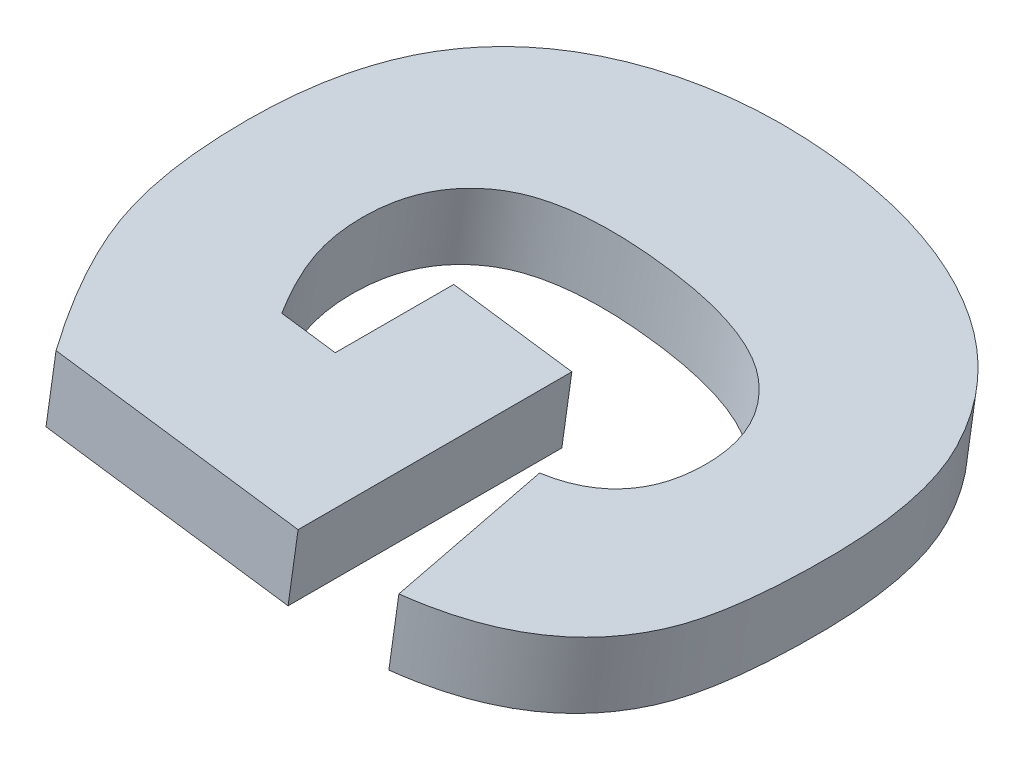
ISO-10303-21;
HEADER;
FILE_DESCRIPTION(('STEP AP214'),'2;1');
FILE_NAME('part.step','',(''),(''),'','','');
FILE_SCHEMA(('AUTOMOTIVE_DESIGN { 1 0 10303 214 1 1 1 1 }'));
ENDSEC;
DATA;
#1=APPLICATION_CONTEXT('core data for automotive mechanical design processes');
#2=APPLICATION_PROTOCOL_DEFINITION('international standard','automotive_design',2000,#1);
#3=PRODUCT_CONTEXT('',#1,'mechanical');
#4=PRODUCT('Part','Part','',(#3));
#5=PRODUCT_RELATED_PRODUCT_CATEGORY('part','',(#4));
#6=PRODUCT_DEFINITION_FORMATION('','',#4);
#7=PRODUCT_DEFINITION_CONTEXT('part definition',#1,'design');
#8=PRODUCT_DEFINITION('design','',#6,#7);
#9=PRODUCT_DEFINITION_SHAPE('','',#8);
#10=(LENGTH_UNIT() NAMED_UNIT(*) SI_UNIT(.MILLI.,.METRE.));
#11=(NAMED_UNIT(*) PLANE_ANGLE_UNIT() SI_UNIT($,.RADIAN.));
#12=(NAMED_UNIT(*) SI_UNIT($,.STERADIAN.) SOLID_ANGLE_UNIT());
#13=UNCERTAINTY_MEASURE_WITH_UNIT(LENGTH_MEASURE(1.E-05),#10,'distance_accuracy_value','');
#14=(GEOMETRIC_REPRESENTATION_CONTEXT(3) GLOBAL_UNCERTAINTY_ASSIGNED_CONTEXT((#13)) GLOBAL_UNIT_ASSIGNED_CONTEXT((#10,
#11,#12)) REPRESENTATION_CONTEXT('',''));
#15=CARTESIAN_POINT('',(0.,0.,0.));
#16=DIRECTION('',(0.,0.,1.));
#17=DIRECTION('',(1.,0.,0.));
#18=AXIS2_PLACEMENT_3D('',#15,#16,#17);
#19=CARTESIAN_POINT('',(833.200849516409,618.797225788502,1905.91123313202));
#20=DIRECTION('',(-0.000106014336866078,-0.000754331202662453,-0.999999709872657));
#21=DIRECTION('',(-0.990268068741567,0.139173100960088,0.));
#22=AXIS2_PLACEMENT_3D('',#19,#20,#21);
#23=PLANE('',#22);
#24=CARTESIAN_POINT('',(831.809118910587,608.894547974125,1905.91885057649));
#25=CARTESIAN_POINT('',(840.050094653184,607.736354364498,1905.91885057649));
#26=CARTESIAN_POINT('',(848.291070395781,606.578160754871,1905.91885057649));
#27=B_SPLINE_CURVE_WITH_KNOTS('',2,(#24,#25,#26),.UNSPECIFIED.,.F.,.F.,(3,3),(0.,1.),.UNSPECIFIED.);
#28=CARTESIAN_POINT('',(831.809118910587,608.894547974125,1905.91885057649));
#29=VERTEX_POINT('',#28);
#30=CARTESIAN_POINT('',(848.291070395781,606.578160754871,1905.91885057649));
#31=VERTEX_POINT('',#30);
#32=EDGE_CURVE('E123',#29,#31,#27,.T.);
#33=ORIENTED_EDGE('',*,*,#32,.F.);
#34=DIRECTION('',(-0.139173060582166,-0.990267781437723,0.000761744447259926));
#35=VECTOR('',#34,1.);
#36=CARTESIAN_POINT('',(833.200849516409,618.797225788502,1905.91123313202));
#37=LINE('',#36,#35);
#38=CARTESIAN_POINT('',(833.200849516409,618.797225788502,1905.91123313202));
#39=VERTEX_POINT('',#38);
#40=EDGE_CURVE('E33',#39,#29,#37,.T.);
#41=ORIENTED_EDGE('',*,*,#40,.F.);
#42=CARTESIAN_POINT('',(833.200849516409,618.797225788502,1905.91123313202));
#43=CARTESIAN_POINT('',(841.441825259006,617.639032178875,1905.91123313202));
#44=CARTESIAN_POINT('',(849.682801001603,616.480838569249,1905.91123313202));
#45=B_SPLINE_CURVE_WITH_KNOTS('',2,(#42,#43,#44),.UNSPECIFIED.,.F.,.F.,(3,3),(0.,1.),.UNSPECIFIED.);
#46=CARTESIAN_POINT('',(849.682801001603,616.480838569249,1905.91123313202));
#47=VERTEX_POINT('',#46);
#48=EDGE_CURVE('E183',#39,#47,#45,.T.);
#49=ORIENTED_EDGE('',*,*,#48,.T.);
#50=DIRECTION('',(-0.139173060582166,-0.990267781437723,0.000761744447259926));
#51=VECTOR('',#50,1.);
#52=CARTESIAN_POINT('',(849.682801001603,616.480838569249,1905.91123313202));
#53=LINE('',#52,#51);
#54=EDGE_CURVE('E11',#47,#31,#53,.T.);
#55=ORIENTED_EDGE('',*,*,#54,.T.);
#56=EDGE_LOOP('',(#33,#41,#49,#55));
#57=FACE_BOUND('',#56,.T.);
#58=ADVANCED_FACE('F17',(#57),#23,.T.);
#59=CARTESIAN_POINT('',(849.682801001603,616.480838569249,1905.91123313202));
#60=DIRECTION('',(0.990268068741567,-0.139173100960088,0.));
#61=DIRECTION('',(-0.000106014336869298,-0.000754331202661995,-0.999999709872657));
#62=AXIS2_PLACEMENT_3D('',#59,#60,#61);
#63=PLANE('',#62);
#64=CARTESIAN_POINT('',(848.291070395781,606.578160754871,1905.91885057649));
#65=CARTESIAN_POINT('',(848.293095226226,606.592568172112,1925.01843575823));
#66=CARTESIAN_POINT('',(848.295120056671,606.606975589352,1944.11802093997));
#67=B_SPLINE_CURVE_WITH_KNOTS('',2,(#64,#65,#66),.UNSPECIFIED.,.F.,.F.,(3,3),(1.,2.),.UNSPECIFIED.);
#68=CARTESIAN_POINT('',(848.295120056671,606.606975589352,1944.11802093997));
#69=VERTEX_POINT('',#68);
#70=EDGE_CURVE('E131',#31,#69,#67,.T.);
#71=ORIENTED_EDGE('',*,*,#70,.F.);
#72=ORIENTED_EDGE('',*,*,#54,.F.);
#73=CARTESIAN_POINT('',(849.682801001603,616.480838569249,1905.91123313202));
#74=CARTESIAN_POINT('',(849.684825832048,616.495245986489,1925.01081831376));
#75=CARTESIAN_POINT('',(849.686850662493,616.509653403729,1944.1104034955));
#76=B_SPLINE_CURVE_WITH_KNOTS('',2,(#73,#74,#75),.UNSPECIFIED.,.F.,.F.,(3,3),(1.,2.),.UNSPECIFIED.);
#77=CARTESIAN_POINT('',(849.686850662493,616.509653403729,1944.1104034955));
#78=VERTEX_POINT('',#77);
#79=EDGE_CURVE('E195',#47,#78,#76,.T.);
#80=ORIENTED_EDGE('',*,*,#79,.T.);
#81=DIRECTION('',(-0.139173060582166,-0.990267781437723,0.000761744447259926));
#82=VECTOR('',#81,1.);
#83=CARTESIAN_POINT('',(849.686850662493,616.509653403729,1944.1104034955));
#84=LINE('',#83,#82);
#85=EDGE_CURVE('E25',#78,#69,#84,.T.);
#86=ORIENTED_EDGE('',*,*,#85,.T.);
#87=EDGE_LOOP('',(#71,#72,#80,#86));
#88=FACE_BOUND('',#87,.T.);
#89=ADVANCED_FACE('F194',(#88),#63,.T.);
#90=CARTESIAN_POINT('',(849.686850662493,616.509653403729,1944.1104034955));
#91=DIRECTION('',(0.000106014336858196,0.000754331202663564,0.999999709872657));
#92=DIRECTION('',(0.990268068741567,-0.139173100960088,0.));
#93=AXIS2_PLACEMENT_3D('',#90,#91,#92);
#94=PLANE('',#93);
#95=CARTESIAN_POINT('',(848.295120056671,606.606975589352,1944.11802093997));
#96=CARTESIAN_POINT('',(831.407874682497,608.980323150063,1944.11802093997));
#97=CARTESIAN_POINT('',(814.520629308323,611.353670710774,1944.11802093997));
#98=B_SPLINE_CURVE_WITH_KNOTS('',2,(#95,#96,#97),.UNSPECIFIED.,.F.,.F.,(3,3),(2.,3.),.UNSPECIFIED.);
#99=CARTESIAN_POINT('',(814.520629308323,611.353670710774,1944.11802093997));
#100=VERTEX_POINT('',#99);
#101=EDGE_CURVE('E139',#69,#100,#98,.T.);
#102=ORIENTED_EDGE('',*,*,#101,.F.);
#103=ORIENTED_EDGE('',*,*,#85,.F.);
#104=CARTESIAN_POINT('',(849.686850662493,616.509653403729,1944.1104034955));
#105=CARTESIAN_POINT('',(832.799605288319,618.88300096444,1944.1104034955));
#106=CARTESIAN_POINT('',(815.912359914145,621.256348525151,1944.1104034955));
#107=B_SPLINE_CURVE_WITH_KNOTS('',2,(#104,#105,#106),.UNSPECIFIED.,.F.,.F.,(3,3),(2.,3.),.UNSPECIFIED.);
#108=CARTESIAN_POINT('',(815.912359914145,621.256348525151,1944.1104034955));
#109=VERTEX_POINT('',#108);
#110=EDGE_CURVE('E204',#78,#109,#107,.T.);
#111=ORIENTED_EDGE('',*,*,#110,.T.);
#112=DIRECTION('',(-0.139173060582166,-0.990267781437723,0.000761744447259926));
#113=VECTOR('',#112,1.);
#114=CARTESIAN_POINT('',(815.912359914145,621.256348525151,1944.1104034955));
#115=LINE('',#114,#113);
#116=EDGE_CURVE('E192',#109,#100,#115,.T.);
#117=ORIENTED_EDGE('',*,*,#116,.T.);
#118=EDGE_LOOP('',(#102,#103,#111,#117));
#119=FACE_BOUND('',#118,.T.);
#120=ADVANCED_FACE('F199',(#119),#94,.T.);
#121=CARTESIAN_POINT('',(815.912359914145,621.256348525151,1944.1104034955));
#122=CARTESIAN_POINT('',(808.507828710909,622.288550121866,1933.14178457684));
#123=CARTESIAN_POINT('',(805.831995225629,622.658128529872,1924.71068197519));
#124=CARTESIAN_POINT('',(803.156161740349,623.027706937878,1916.27957937353));
#125=CARTESIAN_POINT('',(803.154935271622,623.018980159435,1904.71068777773));
#126=CARTESIAN_POINT('',(803.153425326633,623.008236342579,1890.46785425649));
#127=CARTESIAN_POINT('',(807.961961138889,622.325535471185,1881.49104922107));
#128=CARTESIAN_POINT('',(812.770496951144,621.642834599792,1872.51424418566));
#129=CARTESIAN_POINT('',(822.280869982579,620.302439907142,1867.57563716009));
#130=CARTESIAN_POINT('',(831.791243014013,618.962045214491,1862.63703013453));
#131=CARTESIAN_POINT('',(844.11217723901,617.230450834197,1862.63703013453));
#132=CARTESIAN_POINT('',(857.081581686376,615.407719907571,1862.63703013453));
#133=CARTESIAN_POINT('',(866.674109796661,614.063733733963,1868.03948422879));
#134=CARTESIAN_POINT('',(876.266637906946,612.719747560356,1873.44193832305));
#135=CARTESIAN_POINT('',(881.220351237973,612.031573256777,1883.8740520141));
#136=CARTESIAN_POINT('',(885.076992072262,611.495805249437,1891.99582107103));
#137=CARTESIAN_POINT('',(885.078449950182,611.506178589851,1905.74752240188));
#138=CARTESIAN_POINT('',(885.079855761034,611.51618145382,1919.00809154235));
#139=CARTESIAN_POINT('',(882.702828732547,611.855309058304,1925.58380586921));
#140=CARTESIAN_POINT('',(880.325801704059,612.194436662788,1932.15952019606));
#141=CARTESIAN_POINT('',(875.327636999076,612.900220082674,1936.49785454449));
#142=CARTESIAN_POINT('',(870.329472294093,613.606003502561,1940.83618889292));
#143=CARTESIAN_POINT('',(862.656139405261,614.686099196118,1943.01899862797));
#144=B_SPLINE_CURVE_WITH_KNOTS('',2,(#121,#122,#123,#124,#125,#126,#127,#128,#129,#130,#131,
#132,#133,#134,#135,#136,#137,#138,#139,#140,#141,#142,#143),.UNSPECIFIED.,.F.,.F.,(3,2,2,2,2,2,
2,2,2,2,2,3),(3.,4.,5.,6.,7.,8.,9.,10.,11.,12.,13.,14.),.UNSPECIFIED.);
#145=DIRECTION('',(-0.139173060582166,-0.990267781437723,0.000761744447259926));
#146=VECTOR('',#145,1.);
#147=SURFACE_OF_LINEAR_EXTRUSION('',#144,#146);
#148=CARTESIAN_POINT('',(814.520629308323,611.353670710774,1944.11802093997));
#149=CARTESIAN_POINT('',(807.116098105087,612.385872307489,1933.14940202131));
#150=CARTESIAN_POINT('',(804.440264619807,612.755450715495,1924.71829941966));
#151=CARTESIAN_POINT('',(801.764431134527,613.125029123501,1916.287196818));
#152=CARTESIAN_POINT('',(801.7632046658,613.116302345058,1904.7183052222));
#153=CARTESIAN_POINT('',(801.761694720812,613.105558528202,1890.47547170097));
#154=CARTESIAN_POINT('',(806.570230533067,612.422857656808,1881.49866666554));
#155=CARTESIAN_POINT('',(811.378766345323,611.740156785415,1872.52186163013));
#156=CARTESIAN_POINT('',(820.889139376757,610.399762092764,1867.58325460456));
#157=CARTESIAN_POINT('',(830.399512408191,609.059367400114,1862.644647579));
#158=CARTESIAN_POINT('',(842.720446633189,607.327773019819,1862.644647579));
#159=CARTESIAN_POINT('',(855.689851080554,605.505042093193,1862.644647579));
#160=CARTESIAN_POINT('',(865.28237919084,604.161055919586,1868.04710167326));
#161=CARTESIAN_POINT('',(874.874907301125,602.817069745979,1873.44955576752));
#162=CARTESIAN_POINT('',(879.828620632151,602.128895442399,1883.88166945857));
#163=CARTESIAN_POINT('',(883.68526146644,601.59312743506,1892.0034385155));
#164=CARTESIAN_POINT('',(883.686719344361,601.603500775473,1905.75513984635));
#165=CARTESIAN_POINT('',(883.688125155212,601.613503639443,1919.01570898683));
#166=CARTESIAN_POINT('',(881.311098126725,601.952631243927,1925.59142331368));
#167=CARTESIAN_POINT('',(878.934071098237,602.291758848411,1932.16713764054));
#168=CARTESIAN_POINT('',(873.935906393254,602.997542268297,1936.50547198896));
#169=CARTESIAN_POINT('',(868.937741688271,603.703325688184,1940.84380633738));
#170=CARTESIAN_POINT('',(861.26440879944,604.783421381741,1943.02661607244));
#171=B_SPLINE_CURVE_WITH_KNOTS('',2,(#148,#149,#150,#151,#152,#153,#154,#155,#156,#157,#158,
#159,#160,#161,#162,#163,#164,#165,#166,#167,#168,#169,#170),.UNSPECIFIED.,.F.,.F.,(3,2,2,2,2,2,
2,2,2,2,2,3),(3.,4.,5.,6.,7.,8.,9.,10.,11.,12.,13.,14.),.UNSPECIFIED.);
#172=CARTESIAN_POINT('',(861.26440879944,604.783421381741,1943.02661607244));
#173=VERTEX_POINT('',#172);
#174=EDGE_CURVE('E147',#100,#173,#171,.T.);
#175=ORIENTED_EDGE('',*,*,#174,.F.);
#176=ORIENTED_EDGE('',*,*,#116,.F.);
#177=CARTESIAN_POINT('',(862.656139405261,614.686099196118,1943.01899862797));
#178=VERTEX_POINT('',#177);
#179=EDGE_CURVE('E220',#109,#178,#144,.T.);
#180=ORIENTED_EDGE('',*,*,#179,.T.);
#181=DIRECTION('',(-0.139173060582166,-0.990267781437723,0.000761744447259926));
#182=VECTOR('',#181,1.);
#183=CARTESIAN_POINT('',(862.656139405261,614.686099196118,1943.01899862797));
#184=LINE('',#183,#182);
#185=EDGE_CURVE('E190',#178,#173,#184,.T.);
#186=ORIENTED_EDGE('',*,*,#185,.T.);
#187=EDGE_LOOP('',(#175,#176,#180,#186));
#188=FACE_BOUND('',#187,.T.);
#189=ADVANCED_FACE('F234',(#188),#147,.T.);
#190=CARTESIAN_POINT('',(862.656139405261,614.686099196118,1943.01899862797));
#191=DIRECTION('',(-0.974842350306355,0.13714032116814,0.17571261866776));
#192=DIRECTION('',(0.17410701093688,-0.0237118821755995,0.984441209715601));
#193=AXIS2_PLACEMENT_3D('',#190,#191,#192);
#194=PLANE('',#193);
#195=CARTESIAN_POINT('',(861.26440879944,604.783421381741,1943.02661607244));
#196=CARTESIAN_POINT('',(859.155616504022,605.070620812555,1931.1030178947));
#197=CARTESIAN_POINT('',(857.046824208605,605.357820243368,1919.17941971695));
#198=B_SPLINE_CURVE_WITH_KNOTS('',2,(#195,#196,#197),.UNSPECIFIED.,.F.,.F.,(3,3),(14.,15.),.UNSPECIFIED.);
#199=CARTESIAN_POINT('',(857.046824208605,605.357820243368,1919.17941971695));
#200=VERTEX_POINT('',#199);
#201=EDGE_CURVE('E155',#173,#200,#198,.T.);
#202=ORIENTED_EDGE('',*,*,#201,.F.);
#203=ORIENTED_EDGE('',*,*,#185,.F.);
#204=CARTESIAN_POINT('',(862.656139405261,614.686099196118,1943.01899862797));
#205=CARTESIAN_POINT('',(860.547347109844,614.973298626932,1931.09540045023));
#206=CARTESIAN_POINT('',(858.438554814427,615.260498057746,1919.17180227248));
#207=B_SPLINE_CURVE_WITH_KNOTS('',2,(#204,#205,#206),.UNSPECIFIED.,.F.,.F.,(3,3),(14.,15.),.UNSPECIFIED.);
#208=CARTESIAN_POINT('',(858.438554814427,615.260498057746,1919.17180227248));
#209=VERTEX_POINT('',#208);
#210=EDGE_CURVE('E104',#178,#209,#207,.T.);
#211=ORIENTED_EDGE('',*,*,#210,.T.);
#212=DIRECTION('',(-0.139173060582166,-0.990267781437723,0.000761744447259926));
#213=VECTOR('',#212,1.);
#214=CARTESIAN_POINT('',(858.438554814427,615.260498057746,1919.17180227248));
#215=LINE('',#214,#213);
#216=EDGE_CURVE('E96',#209,#200,#215,.T.);
#217=ORIENTED_EDGE('',*,*,#216,.T.);
#218=EDGE_LOOP('',(#202,#203,#211,#217));
#219=FACE_BOUND('',#218,.T.);
#220=ADVANCED_FACE('F238',(#219),#194,.T.);
#221=CARTESIAN_POINT('',(858.438554814427,615.260498057746,1919.17180227248));
#222=CARTESIAN_POINT('',(862.923650984602,614.629025516291,1917.69840570132));
#223=CARTESIAN_POINT('',(865.30100198596,614.292203098566,1914.17862500354));
#224=CARTESIAN_POINT('',(867.678352987319,613.95538068084,1910.65884430576));
#225=CARTESIAN_POINT('',(867.677774464335,613.951264275915,1905.20181996812));
#226=CARTESIAN_POINT('',(867.676912465088,613.945130832575,1897.07085370504));
#227=CARTESIAN_POINT('',(862.083344804321,614.727540526323,1892.24138716623));
#228=CARTESIAN_POINT('',(856.489777143554,615.509950220071,1887.41192062741));
#229=CARTESIAN_POINT('',(844.384999659345,617.211165751589,1887.41192062741));
#230=CARTESIAN_POINT('',(831.523673582374,619.018707253826,1887.41192062741));
#231=CARTESIAN_POINT('',(826.012194470315,619.797052080051,1892.2959574096));
#232=CARTESIAN_POINT('',(820.500715358256,620.575396906275,1897.17999419179));
#233=CARTESIAN_POINT('',(820.50164099503,620.581983154157,1905.91123313202));
#234=CARTESIAN_POINT('',(820.502080672498,620.5851116219,1910.05857162862));
#235=CARTESIAN_POINT('',(821.691341927699,620.420868273025,1913.82391842159));
#236=CARTESIAN_POINT('',(822.8806031829,620.25662492415,1917.58926521456));
#237=CARTESIAN_POINT('',(825.745194883816,619.857768778238,1922.44601687506));
#238=B_SPLINE_CURVE_WITH_KNOTS('',2,(#221,#222,#223,#224,#225,#226,#227,#228,#229,#230,#231,
#232,#233,#234,#235,#236,#237),.UNSPECIFIED.,.F.,.F.,(3,2,2,2,2,2,2,2,3),(15.,16.,17.,18.,19.,
20.,21.,22.,23.),.UNSPECIFIED.);
#239=DIRECTION('',(-0.139173060582166,-0.990267781437723,0.000761744447259926));
#240=VECTOR('',#239,1.);
#241=SURFACE_OF_LINEAR_EXTRUSION('',#238,#240);
#242=CARTESIAN_POINT('',(857.046824208605,605.357820243368,1919.17941971695));
#243=CARTESIAN_POINT('',(861.53192037878,604.726347701914,1917.70602314579));
#244=CARTESIAN_POINT('',(863.909271380139,604.389525284188,1914.18624244801));
#245=CARTESIAN_POINT('',(866.286622381498,604.052702866463,1910.66646175023));
#246=CARTESIAN_POINT('',(866.286043858513,604.048586461537,1905.20943741259));
#247=CARTESIAN_POINT('',(866.285181859267,604.042453018198,1897.07847114951));
#248=CARTESIAN_POINT('',(860.691614198499,604.824862711946,1892.2490046107));
#249=CARTESIAN_POINT('',(855.098046537732,605.607272405694,1887.41953807188));
#250=CARTESIAN_POINT('',(842.993269053524,607.308487937212,1887.41953807188));
#251=CARTESIAN_POINT('',(830.131942976553,609.116029439449,1887.41953807188));
#252=CARTESIAN_POINT('',(824.620463864493,609.894374265674,1892.30357485408));
#253=CARTESIAN_POINT('',(819.108984752434,610.672719091898,1897.18761163626));
#254=CARTESIAN_POINT('',(819.109910389209,610.67930533978,1905.91885057649));
#255=CARTESIAN_POINT('',(819.110350066677,610.682433807523,1910.0661890731));
#256=CARTESIAN_POINT('',(820.299611321878,610.518190458648,1913.83153586606));
#257=CARTESIAN_POINT('',(821.488872577079,610.353947109773,1917.59688265904));
#258=CARTESIAN_POINT('',(824.353464277995,609.95509096386,1922.45363431954));
#259=B_SPLINE_CURVE_WITH_KNOTS('',2,(#242,#243,#244,#245,#246,#247,#248,#249,#250,#251,#252,
#253,#254,#255,#256,#257,#258),.UNSPECIFIED.,.F.,.F.,(3,2,2,2,2,2,2,2,3),(15.,16.,17.,18.,19.,
20.,21.,22.,23.),.UNSPECIFIED.);
#260=CARTESIAN_POINT('',(824.353464277995,609.95509096386,1922.45363431954));
#261=VERTEX_POINT('',#260);
#262=EDGE_CURVE('E163',#200,#261,#259,.T.);
#263=ORIENTED_EDGE('',*,*,#262,.F.);
#264=ORIENTED_EDGE('',*,*,#216,.F.);
#265=CARTESIAN_POINT('',(825.745194883816,619.857768778238,1922.44601687506));
#266=VERTEX_POINT('',#265);
#267=EDGE_CURVE('E99',#209,#266,#238,.T.);
#268=ORIENTED_EDGE('',*,*,#267,.T.);
#269=DIRECTION('',(-0.139173060582166,-0.990267781437723,0.000761744447259926));
#270=VECTOR('',#269,1.);
#271=CARTESIAN_POINT('',(825.745194883816,619.857768778238,1922.44601687506));
#272=LINE('',#271,#270);
#273=EDGE_CURVE('E85',#266,#261,#272,.T.);
#274=ORIENTED_EDGE('',*,*,#273,.T.);
#275=EDGE_LOOP('',(#263,#264,#268,#274));
#276=FACE_BOUND('',#275,.T.);
#277=ADVANCED_FACE('F100',(#276),#241,.T.);
#278=CARTESIAN_POINT('',(825.745194883816,619.857768778238,1922.44601687506));
#279=DIRECTION('',(-0.000106014336873184,-0.000754331202661447,-0.999999709872657));
#280=DIRECTION('',(-0.990268068741567,0.139173100960088,0.));
#281=AXIS2_PLACEMENT_3D('',#278,#279,#280);
#282=PLANE('',#281);
#283=CARTESIAN_POINT('',(824.353464277995,609.95509096386,1922.45363431954));
#284=CARTESIAN_POINT('',(828.082168056612,609.431055822455,1922.45363431954));
#285=CARTESIAN_POINT('',(831.81087183523,608.90702068105,1922.45363431954));
#286=B_SPLINE_CURVE_WITH_KNOTS('',2,(#283,#284,#285),.UNSPECIFIED.,.F.,.F.,(3,3),(23.,24.),.UNSPECIFIED.);
#287=CARTESIAN_POINT('',(831.81087183523,608.90702068105,1922.45363431954));
#288=VERTEX_POINT('',#287);
#289=EDGE_CURVE('E92',#261,#288,#286,.T.);
#290=ORIENTED_EDGE('',*,*,#289,.F.);
#291=ORIENTED_EDGE('',*,*,#273,.F.);
#292=CARTESIAN_POINT('',(825.745194883816,619.857768778238,1922.44601687506));
#293=CARTESIAN_POINT('',(829.473898662434,619.333733636833,1922.44601687506));
#294=CARTESIAN_POINT('',(833.202602441052,618.809698495428,1922.44601687506));
#295=B_SPLINE_CURVE_WITH_KNOTS('',2,(#292,#293,#294),.UNSPECIFIED.,.F.,.F.,(3,3),(23.,24.),.UNSPECIFIED.);
#296=CARTESIAN_POINT('',(833.202602441052,618.809698495428,1922.44601687506));
#297=VERTEX_POINT('',#296);
#298=EDGE_CURVE('E89',#266,#297,#295,.T.);
#299=ORIENTED_EDGE('',*,*,#298,.T.);
#300=DIRECTION('',(-0.139173060582166,-0.990267781437723,0.000761744447259926));
#301=VECTOR('',#300,1.);
#302=CARTESIAN_POINT('',(833.202602441052,618.809698495428,1922.44601687506));
#303=LINE('',#302,#301);
#304=EDGE_CURVE('E61',#297,#288,#303,.T.);
#305=ORIENTED_EDGE('',*,*,#304,.T.);
#306=EDGE_LOOP('',(#290,#291,#299,#305));
#307=FACE_BOUND('',#306,.T.);
#308=ADVANCED_FACE('F87',(#307),#282,.T.);
#309=CARTESIAN_POINT('',(833.202602441052,618.809698495428,1922.44601687506));
#310=DIRECTION('',(-0.990268068741567,0.139173100960088,0.));
#311=DIRECTION('',(0.000106014336875237,0.000754331202661163,0.999999709872657));
#312=AXIS2_PLACEMENT_3D('',#309,#310,#311);
#313=PLANE('',#312);
#314=CARTESIAN_POINT('',(831.81087183523,608.90702068105,1922.45363431954));
#315=CARTESIAN_POINT('',(831.809995372909,608.900784327588,1914.18624244801));
#316=CARTESIAN_POINT('',(831.809118910587,608.894547974125,1905.91885057649));
#317=B_SPLINE_CURVE_WITH_KNOTS('',2,(#314,#315,#316),.UNSPECIFIED.,.F.,.F.,(3,3),(24.,25.),.UNSPECIFIED.);
#318=EDGE_CURVE('E176',#288,#29,#317,.T.);
#319=ORIENTED_EDGE('',*,*,#318,.F.);
#320=ORIENTED_EDGE('',*,*,#304,.F.);
#321=CARTESIAN_POINT('',(833.202602441052,618.809698495428,1922.44601687506));
#322=CARTESIAN_POINT('',(833.20172597873,618.803462141965,1914.17862500354));
#323=CARTESIAN_POINT('',(833.200849516409,618.797225788502,1905.91123313202));
#324=B_SPLINE_CURVE_WITH_KNOTS('',2,(#321,#322,#323),.UNSPECIFIED.,.F.,.F.,(3,3),(24.,25.),.UNSPECIFIED.);
#325=EDGE_CURVE('E108',#297,#39,#324,.T.);
#326=ORIENTED_EDGE('',*,*,#325,.T.);
#327=ORIENTED_EDGE('',*,*,#40,.T.);
#328=EDGE_LOOP('',(#319,#320,#326,#327));
#329=FACE_BOUND('',#328,.T.);
#330=ADVANCED_FACE('F296',(#329),#313,.T.);
#331=CARTESIAN_POINT('',(856.237362602106,615.527406095825,1863.98764365809));
#332=DIRECTION('',(0.139173060582166,0.990267781437723,-0.000761744447259926));
#333=DIRECTION('',(-0.947941965636704,0.133001987377289,-0.289338039563609));
#334=AXIS2_PLACEMENT_3D('',#331,#332,#333);
#335=PLANE('',#334);
#336=ORIENTED_EDGE('',*,*,#48,.F.);
#337=ORIENTED_EDGE('',*,*,#325,.F.);
#338=ORIENTED_EDGE('',*,*,#298,.F.);
#339=ORIENTED_EDGE('',*,*,#267,.F.);
#340=ORIENTED_EDGE('',*,*,#210,.F.);
#341=ORIENTED_EDGE('',*,*,#179,.F.);
#342=ORIENTED_EDGE('',*,*,#110,.F.);
#343=ORIENTED_EDGE('',*,*,#79,.F.);
#344=EDGE_LOOP('',(#336,#337,#338,#339,#340,#341,#342,#343));
#345=FACE_BOUND('',#344,.T.);
#346=ADVANCED_FACE('F107',(#345),#335,.T.);
#347=CARTESIAN_POINT('',(854.845631996284,605.624728281448,1863.99526110256));
#348=DIRECTION('',(0.139173060582166,0.990267781437723,-0.000761744447259926));
#349=DIRECTION('',(-0.947941965636704,0.133001987377289,-0.289338039563609));
#350=AXIS2_PLACEMENT_3D('',#347,#348,#349);
#351=PLANE('',#350);
#352=ORIENTED_EDGE('',*,*,#32,.T.);
#353=ORIENTED_EDGE('',*,*,#70,.T.);
#354=ORIENTED_EDGE('',*,*,#101,.T.);
#355=ORIENTED_EDGE('',*,*,#174,.T.);
#356=ORIENTED_EDGE('',*,*,#201,.T.);
#357=ORIENTED_EDGE('',*,*,#262,.T.);
#358=ORIENTED_EDGE('',*,*,#289,.T.);
#359=ORIENTED_EDGE('',*,*,#318,.T.);
#360=EDGE_LOOP('',(#352,#353,#354,#355,#356,#357,#358,#359));
#361=FACE_BOUND('',#360,.T.);
#362=ADVANCED_FACE('F202',(#361),#351,.F.);
#363=CLOSED_SHELL('',(#58,#89,#120,#189,#220,#277,#308,#330,#346,#362));
#364=MANIFOLD_SOLID_BREP('B1',#363);
#365=ADVANCED_BREP_SHAPE_REPRESENTATION('',(#18,#364),#14);
#366=SHAPE_DEFINITION_REPRESENTATION(#9,#365);
ENDSEC;
END-ISO-10303-21;
